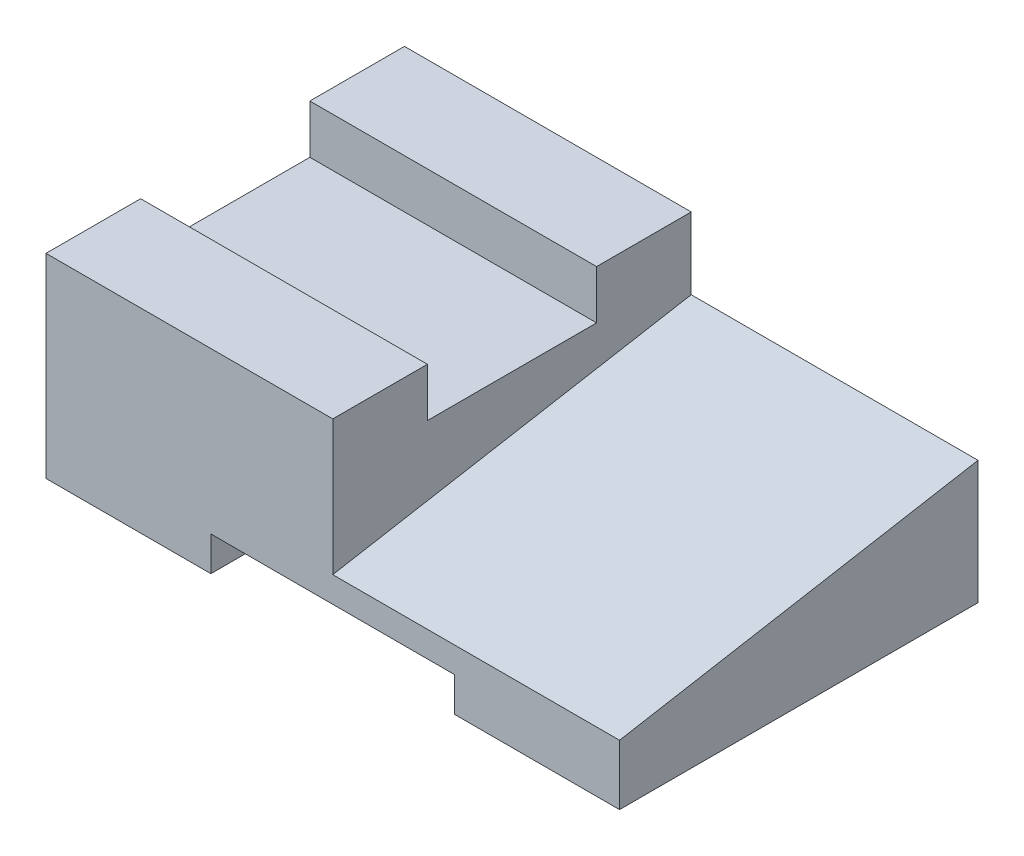
ISO-10303-21;
HEADER;
FILE_DESCRIPTION(('STEP AP214'),'2;1');
FILE_NAME('part.step','',(''),(''),'','','');
FILE_SCHEMA(('AUTOMOTIVE_DESIGN { 1 0 10303 214 1 1 1 1 }'));
ENDSEC;
DATA;
#1=APPLICATION_CONTEXT('core data for automotive mechanical design processes');
#2=APPLICATION_PROTOCOL_DEFINITION('international standard','automotive_design',2000,#1);
#3=PRODUCT_CONTEXT('',#1,'mechanical');
#4=PRODUCT('Part','Part','',(#3));
#5=PRODUCT_RELATED_PRODUCT_CATEGORY('part','',(#4));
#6=PRODUCT_DEFINITION_FORMATION('','',#4);
#7=PRODUCT_DEFINITION_CONTEXT('part definition',#1,'design');
#8=PRODUCT_DEFINITION('design','',#6,#7);
#9=PRODUCT_DEFINITION_SHAPE('','',#8);
#10=(LENGTH_UNIT() NAMED_UNIT(*) SI_UNIT(.MILLI.,.METRE.));
#11=(NAMED_UNIT(*) PLANE_ANGLE_UNIT() SI_UNIT($,.RADIAN.));
#12=(NAMED_UNIT(*) SI_UNIT($,.STERADIAN.) SOLID_ANGLE_UNIT());
#13=UNCERTAINTY_MEASURE_WITH_UNIT(LENGTH_MEASURE(1.E-05),#10,'distance_accuracy_value','');
#14=(GEOMETRIC_REPRESENTATION_CONTEXT(3) GLOBAL_UNCERTAINTY_ASSIGNED_CONTEXT((#13)) GLOBAL_UNIT_ASSIGNED_CONTEXT((#10,
#11,#12)) REPRESENTATION_CONTEXT('',''));
#15=CARTESIAN_POINT('',(0.,0.,0.));
#16=DIRECTION('',(0.,0.,1.));
#17=DIRECTION('',(1.,0.,0.));
#18=AXIS2_PLACEMENT_3D('',#15,#16,#17);
#19=CARTESIAN_POINT('',(0.,68.,-125.));
#20=DIRECTION('',(0.,-1.,0.));
#21=DIRECTION('',(0.,0.,-1.));
#22=AXIS2_PLACEMENT_3D('',#19,#20,#21);
#23=PLANE('',#22);
#24=DIRECTION('',(1.,0.,0.));
#25=VECTOR('',#24,1.);
#26=CARTESIAN_POINT('',(-100.,68.,-33.));
#27=LINE('',#26,#25);
#28=CARTESIAN_POINT('',(-100.,68.,-33.));
#29=VERTEX_POINT('',#28);
#30=CARTESIAN_POINT('',(0.,68.,-33.));
#31=VERTEX_POINT('',#30);
#32=EDGE_CURVE('E170',#29,#31,#27,.T.);
#33=ORIENTED_EDGE('',*,*,#32,.F.);
#34=DIRECTION('',(0.,0.,1.));
#35=VECTOR('',#34,1.);
#36=CARTESIAN_POINT('',(-100.,68.,-125.));
#37=LINE('',#36,#35);
#38=CARTESIAN_POINT('',(-100.,68.,0.));
#39=VERTEX_POINT('',#38);
#40=EDGE_CURVE('E238',#29,#39,#37,.T.);
#41=ORIENTED_EDGE('',*,*,#40,.T.);
#42=DIRECTION('',(1.,0.,0.));
#43=VECTOR('',#42,1.);
#44=CARTESIAN_POINT('',(0.,68.,0.));
#45=LINE('',#44,#43);
#46=CARTESIAN_POINT('',(0.,68.,0.));
#47=VERTEX_POINT('',#46);
#48=EDGE_CURVE('E217',#39,#47,#45,.T.);
#49=ORIENTED_EDGE('',*,*,#48,.T.);
#50=DIRECTION('',(0.,0.,1.));
#51=VECTOR('',#50,1.);
#52=CARTESIAN_POINT('',(0.,68.,0.));
#53=LINE('',#52,#51);
#54=EDGE_CURVE('E175',#31,#47,#53,.T.);
#55=ORIENTED_EDGE('',*,*,#54,.F.);
#56=EDGE_LOOP('',(#33,#41,#49,#55));
#57=FACE_BOUND('',#56,.T.);
#58=ADVANCED_FACE('F41',(#57),#23,.F.);
#59=CARTESIAN_POINT('',(-100.,68.,-125.));
#60=VERTEX_POINT('',#59);
#61=CARTESIAN_POINT('',(-100.,68.,-92.));
#62=VERTEX_POINT('',#61);
#63=EDGE_CURVE('E236',#60,#62,#37,.T.);
#64=ORIENTED_EDGE('',*,*,#63,.T.);
#65=DIRECTION('',(1.,0.,0.));
#66=VECTOR('',#65,1.);
#67=CARTESIAN_POINT('',(-100.,68.,-92.));
#68=LINE('',#67,#66);
#69=CARTESIAN_POINT('',(0.,68.,-92.));
#70=VERTEX_POINT('',#69);
#71=EDGE_CURVE('E146',#62,#70,#68,.T.);
#72=ORIENTED_EDGE('',*,*,#71,.T.);
#73=CARTESIAN_POINT('',(0.,68.,-125.));
#74=VERTEX_POINT('',#73);
#75=EDGE_CURVE('E174',#74,#70,#53,.T.);
#76=ORIENTED_EDGE('',*,*,#75,.F.);
#77=DIRECTION('',(1.,0.,0.));
#78=VECTOR('',#77,1.);
#79=CARTESIAN_POINT('',(0.,68.,-125.));
#80=LINE('',#79,#78);
#81=EDGE_CURVE('E197',#60,#74,#80,.T.);
#82=ORIENTED_EDGE('',*,*,#81,.F.);
#83=EDGE_LOOP('',(#64,#72,#76,#82));
#84=FACE_BOUND('',#83,.T.);
#85=ADVANCED_FACE('F247',(#84),#23,.F.);
#86=CARTESIAN_POINT('',(100.,0.,-125.));
#87=DIRECTION('',(1.,0.,0.));
#88=DIRECTION('',(0.,0.,-1.));
#89=AXIS2_PLACEMENT_3D('',#86,#87,#88);
#90=PLANE('',#89);
#91=DIRECTION('',(0.,1.,0.));
#92=VECTOR('',#91,1.);
#93=CARTESIAN_POINT('',(100.,0.,-125.));
#94=LINE('',#93,#92);
#95=CARTESIAN_POINT('',(100.,0.,-125.));
#96=VERTEX_POINT('',#95);
#97=CARTESIAN_POINT('',(100.,43.,-125.));
#98=VERTEX_POINT('',#97);
#99=EDGE_CURVE('E194',#96,#98,#94,.T.);
#100=ORIENTED_EDGE('',*,*,#99,.T.);
#101=DIRECTION('',(0.,-0.173648177666924,0.984807753012209));
#102=VECTOR('',#101,1.);
#103=CARTESIAN_POINT('',(100.,20.3271323890436,3.58422188062117));
#104=LINE('',#103,#102);
#105=CARTESIAN_POINT('',(100.,20.9591274114427,0.));
#106=VERTEX_POINT('',#105);
#107=EDGE_CURVE('E167',#98,#106,#104,.T.);
#108=ORIENTED_EDGE('',*,*,#107,.T.);
#109=DIRECTION('',(0.,1.,0.));
#110=VECTOR('',#109,1.);
#111=CARTESIAN_POINT('',(100.,0.,0.));
#112=LINE('',#111,#110);
#113=CARTESIAN_POINT('',(100.,0.,0.));
#114=VERTEX_POINT('',#113);
#115=EDGE_CURVE('E212',#114,#106,#112,.T.);
#116=ORIENTED_EDGE('',*,*,#115,.F.);
#117=DIRECTION('',(0.,0.,1.));
#118=VECTOR('',#117,1.);
#119=CARTESIAN_POINT('',(100.,0.,-125.));
#120=LINE('',#119,#118);
#121=EDGE_CURVE('E242',#96,#114,#120,.T.);
#122=ORIENTED_EDGE('',*,*,#121,.F.);
#123=EDGE_LOOP('',(#100,#108,#116,#122));
#124=FACE_BOUND('',#123,.T.);
#125=ADVANCED_FACE('F284',(#124),#90,.T.);
#126=CARTESIAN_POINT('',(42.5,0.,-125.));
#127=DIRECTION('',(1.,0.,0.));
#128=DIRECTION('',(0.,0.,-1.));
#129=AXIS2_PLACEMENT_3D('',#126,#127,#128);
#130=PLANE('',#129);
#131=DIRECTION('',(0.,1.,0.));
#132=VECTOR('',#131,1.);
#133=CARTESIAN_POINT('',(42.5,0.,0.));
#134=LINE('',#133,#132);
#135=CARTESIAN_POINT('',(42.5,0.,0.));
#136=VERTEX_POINT('',#135);
#137=CARTESIAN_POINT('',(42.5,12.,0.));
#138=VERTEX_POINT('',#137);
#139=EDGE_CURVE('E183',#136,#138,#134,.T.);
#140=ORIENTED_EDGE('',*,*,#139,.T.);
#141=DIRECTION('',(0.,0.,1.));
#142=VECTOR('',#141,1.);
#143=CARTESIAN_POINT('',(42.5,12.,-125.));
#144=LINE('',#143,#142);
#145=CARTESIAN_POINT('',(42.5,12.,-125.));
#146=VERTEX_POINT('',#145);
#147=EDGE_CURVE('E226',#146,#138,#144,.T.);
#148=ORIENTED_EDGE('',*,*,#147,.F.);
#149=DIRECTION('',(0.,1.,0.));
#150=VECTOR('',#149,1.);
#151=CARTESIAN_POINT('',(42.5,0.,-125.));
#152=LINE('',#151,#150);
#153=CARTESIAN_POINT('',(42.5,0.,-125.));
#154=VERTEX_POINT('',#153);
#155=EDGE_CURVE('E190',#154,#146,#152,.T.);
#156=ORIENTED_EDGE('',*,*,#155,.F.);
#157=DIRECTION('',(0.,0.,1.));
#158=VECTOR('',#157,1.);
#159=CARTESIAN_POINT('',(42.5,0.,-125.));
#160=LINE('',#159,#158);
#161=EDGE_CURVE('E208',#154,#136,#160,.T.);
#162=ORIENTED_EDGE('',*,*,#161,.T.);
#163=EDGE_LOOP('',(#140,#148,#156,#162));
#164=FACE_BOUND('',#163,.T.);
#165=ADVANCED_FACE('F43',(#164),#130,.F.);
#166=CARTESIAN_POINT('',(0.,12.,-125.));
#167=DIRECTION('',(0.,-1.,0.));
#168=DIRECTION('',(0.,0.,-1.));
#169=AXIS2_PLACEMENT_3D('',#166,#167,#168);
#170=PLANE('',#169);
#171=DIRECTION('',(1.,0.,0.));
#172=VECTOR('',#171,1.);
#173=CARTESIAN_POINT('',(0.,12.,0.));
#174=LINE('',#173,#172);
#175=CARTESIAN_POINT('',(-42.5,12.,0.));
#176=VERTEX_POINT('',#175);
#177=EDGE_CURVE('E188',#176,#138,#174,.T.);
#178=ORIENTED_EDGE('',*,*,#177,.F.);
#179=DIRECTION('',(0.,0.,1.));
#180=VECTOR('',#179,1.);
#181=CARTESIAN_POINT('',(-42.5,12.,-125.));
#182=LINE('',#181,#180);
#183=CARTESIAN_POINT('',(-42.5,12.,-125.));
#184=VERTEX_POINT('',#183);
#185=EDGE_CURVE('E235',#184,#176,#182,.T.);
#186=ORIENTED_EDGE('',*,*,#185,.F.);
#187=DIRECTION('',(1.,0.,0.));
#188=VECTOR('',#187,1.);
#189=CARTESIAN_POINT('',(0.,12.,-125.));
#190=LINE('',#189,#188);
#191=EDGE_CURVE('E202',#184,#146,#190,.T.);
#192=ORIENTED_EDGE('',*,*,#191,.T.);
#193=ORIENTED_EDGE('',*,*,#147,.T.);
#194=EDGE_LOOP('',(#178,#186,#192,#193));
#195=FACE_BOUND('',#194,.T.);
#196=ADVANCED_FACE('F275',(#195),#170,.T.);
#197=CARTESIAN_POINT('',(-42.5,0.,-125.));
#198=DIRECTION('',(1.,0.,0.));
#199=DIRECTION('',(0.,0.,-1.));
#200=AXIS2_PLACEMENT_3D('',#197,#198,#199);
#201=PLANE('',#200);
#202=DIRECTION('',(0.,1.,0.));
#203=VECTOR('',#202,1.);
#204=CARTESIAN_POINT('',(-42.5,0.,0.));
#205=LINE('',#204,#203);
#206=CARTESIAN_POINT('',(-42.5,0.,0.));
#207=VERTEX_POINT('',#206);
#208=EDGE_CURVE('E221',#207,#176,#205,.T.);
#209=ORIENTED_EDGE('',*,*,#208,.F.);
#210=DIRECTION('',(0.,0.,1.));
#211=VECTOR('',#210,1.);
#212=CARTESIAN_POINT('',(-42.5,0.,-125.));
#213=LINE('',#212,#211);
#214=CARTESIAN_POINT('',(-42.5,0.,-125.));
#215=VERTEX_POINT('',#214);
#216=EDGE_CURVE('E231',#215,#207,#213,.T.);
#217=ORIENTED_EDGE('',*,*,#216,.F.);
#218=DIRECTION('',(0.,1.,0.));
#219=VECTOR('',#218,1.);
#220=CARTESIAN_POINT('',(-42.5,0.,-125.));
#221=LINE('',#220,#219);
#222=EDGE_CURVE('E205',#215,#184,#221,.T.);
#223=ORIENTED_EDGE('',*,*,#222,.T.);
#224=ORIENTED_EDGE('',*,*,#185,.T.);
#225=EDGE_LOOP('',(#209,#217,#223,#224));
#226=FACE_BOUND('',#225,.T.);
#227=ADVANCED_FACE('F268',(#226),#201,.T.);
#228=CARTESIAN_POINT('',(0.,0.,-125.));
#229=DIRECTION('',(0.,-1.,0.));
#230=DIRECTION('',(0.,0.,-1.));
#231=AXIS2_PLACEMENT_3D('',#228,#229,#230);
#232=PLANE('',#231);
#233=DIRECTION('',(1.,0.,0.));
#234=VECTOR('',#233,1.);
#235=CARTESIAN_POINT('',(0.,0.,0.));
#236=LINE('',#235,#234);
#237=CARTESIAN_POINT('',(-100.,0.,0.));
#238=VERTEX_POINT('',#237);
#239=EDGE_CURVE('E214',#238,#207,#236,.T.);
#240=ORIENTED_EDGE('',*,*,#239,.F.);
#241=DIRECTION('',(0.,0.,1.));
#242=VECTOR('',#241,1.);
#243=CARTESIAN_POINT('',(-100.,0.,-125.));
#244=LINE('',#243,#242);
#245=CARTESIAN_POINT('',(-100.,0.,-125.));
#246=VERTEX_POINT('',#245);
#247=EDGE_CURVE('E237',#246,#238,#244,.T.);
#248=ORIENTED_EDGE('',*,*,#247,.F.);
#249=DIRECTION('',(1.,0.,0.));
#250=VECTOR('',#249,1.);
#251=CARTESIAN_POINT('',(0.,0.,-125.));
#252=LINE('',#251,#250);
#253=EDGE_CURVE('E191',#246,#215,#252,.T.);
#254=ORIENTED_EDGE('',*,*,#253,.T.);
#255=ORIENTED_EDGE('',*,*,#216,.T.);
#256=EDGE_LOOP('',(#240,#248,#254,#255));
#257=FACE_BOUND('',#256,.T.);
#258=ADVANCED_FACE('F264',(#257),#232,.T.);
#259=CARTESIAN_POINT('',(-100.,0.,-125.));
#260=DIRECTION('',(1.,0.,0.));
#261=DIRECTION('',(0.,0.,-1.));
#262=AXIS2_PLACEMENT_3D('',#259,#260,#261);
#263=PLANE('',#262);
#264=ORIENTED_EDGE('',*,*,#40,.F.);
#265=DIRECTION('',(0.,-1.,0.));
#266=VECTOR('',#265,1.);
#267=CARTESIAN_POINT('',(-100.,0.,-33.));
#268=LINE('',#267,#266);
#269=CARTESIAN_POINT('',(-100.,51.,-33.));
#270=VERTEX_POINT('',#269);
#271=EDGE_CURVE('E149',#29,#270,#268,.T.);
#272=ORIENTED_EDGE('',*,*,#271,.T.);
#273=DIRECTION('',(0.,0.,-1.));
#274=VECTOR('',#273,1.);
#275=CARTESIAN_POINT('',(-100.,51.,0.));
#276=LINE('',#275,#274);
#277=CARTESIAN_POINT('',(-100.,51.,-92.));
#278=VERTEX_POINT('',#277);
#279=EDGE_CURVE('E145',#270,#278,#276,.T.);
#280=ORIENTED_EDGE('',*,*,#279,.T.);
#281=DIRECTION('',(0.,1.,0.));
#282=VECTOR('',#281,1.);
#283=CARTESIAN_POINT('',(-100.,0.,-92.));
#284=LINE('',#283,#282);
#285=EDGE_CURVE('E155',#278,#62,#284,.T.);
#286=ORIENTED_EDGE('',*,*,#285,.T.);
#287=ORIENTED_EDGE('',*,*,#63,.F.);
#288=DIRECTION('',(0.,1.,0.));
#289=VECTOR('',#288,1.);
#290=CARTESIAN_POINT('',(-100.,0.,-125.));
#291=LINE('',#290,#289);
#292=EDGE_CURVE('E199',#246,#60,#291,.T.);
#293=ORIENTED_EDGE('',*,*,#292,.F.);
#294=ORIENTED_EDGE('',*,*,#247,.T.);
#295=DIRECTION('',(0.,1.,0.));
#296=VECTOR('',#295,1.);
#297=CARTESIAN_POINT('',(-100.,0.,0.));
#298=LINE('',#297,#296);
#299=EDGE_CURVE('E222',#238,#39,#298,.T.);
#300=ORIENTED_EDGE('',*,*,#299,.T.);
#301=EDGE_LOOP('',(#264,#272,#280,#286,#287,#293,#294,#300));
#302=FACE_BOUND('',#301,.T.);
#303=ADVANCED_FACE('F159',(#302),#263,.F.);
#304=EDGE_CURVE('E211',#136,#114,#236,.T.);
#305=ORIENTED_EDGE('',*,*,#304,.F.);
#306=ORIENTED_EDGE('',*,*,#161,.F.);
#307=EDGE_CURVE('E186',#154,#96,#252,.T.);
#308=ORIENTED_EDGE('',*,*,#307,.T.);
#309=ORIENTED_EDGE('',*,*,#121,.T.);
#310=EDGE_LOOP('',(#305,#306,#308,#309));
#311=FACE_BOUND('',#310,.T.);
#312=ADVANCED_FACE('F276',(#311),#232,.T.);
#313=CARTESIAN_POINT('',(0.,0.,-125.));
#314=DIRECTION('',(0.,0.,1.));
#315=DIRECTION('',(1.,0.,0.));
#316=AXIS2_PLACEMENT_3D('',#313,#314,#315);
#317=PLANE('',#316);
#318=DIRECTION('',(0.,1.,0.));
#319=VECTOR('',#318,1.);
#320=CARTESIAN_POINT('',(0.,0.,-125.));
#321=LINE('',#320,#319);
#322=CARTESIAN_POINT('',(0.,43.,-125.));
#323=VERTEX_POINT('',#322);
#324=EDGE_CURVE('E168',#323,#74,#321,.T.);
#325=ORIENTED_EDGE('',*,*,#324,.F.);
#326=DIRECTION('',(1.,0.,0.));
#327=VECTOR('',#326,1.);
#328=CARTESIAN_POINT('',(0.,43.,-125.));
#329=LINE('',#328,#327);
#330=EDGE_CURVE('E185',#323,#98,#329,.T.);
#331=ORIENTED_EDGE('',*,*,#330,.T.);
#332=ORIENTED_EDGE('',*,*,#99,.F.);
#333=ORIENTED_EDGE('',*,*,#307,.F.);
#334=ORIENTED_EDGE('',*,*,#155,.T.);
#335=ORIENTED_EDGE('',*,*,#191,.F.);
#336=ORIENTED_EDGE('',*,*,#222,.F.);
#337=ORIENTED_EDGE('',*,*,#253,.F.);
#338=ORIENTED_EDGE('',*,*,#292,.T.);
#339=ORIENTED_EDGE('',*,*,#81,.T.);
#340=EDGE_LOOP('',(#325,#331,#332,#333,#334,#335,#336,#337,#338,#339));
#341=FACE_BOUND('',#340,.T.);
#342=ADVANCED_FACE('F252',(#341),#317,.F.);
#343=CARTESIAN_POINT('',(0.,0.,0.));
#344=DIRECTION('',(0.,0.,1.));
#345=DIRECTION('',(1.,0.,0.));
#346=AXIS2_PLACEMENT_3D('',#343,#344,#345);
#347=PLANE('',#346);
#348=DIRECTION('',(0.,-1.,0.));
#349=VECTOR('',#348,1.);
#350=CARTESIAN_POINT('',(0.,0.,0.));
#351=LINE('',#350,#349);
#352=CARTESIAN_POINT('',(0.,20.9591274114427,0.));
#353=VERTEX_POINT('',#352);
#354=EDGE_CURVE('E61',#47,#353,#351,.T.);
#355=ORIENTED_EDGE('',*,*,#354,.F.);
#356=ORIENTED_EDGE('',*,*,#48,.F.);
#357=ORIENTED_EDGE('',*,*,#299,.F.);
#358=ORIENTED_EDGE('',*,*,#239,.T.);
#359=ORIENTED_EDGE('',*,*,#208,.T.);
#360=ORIENTED_EDGE('',*,*,#177,.T.);
#361=ORIENTED_EDGE('',*,*,#139,.F.);
#362=ORIENTED_EDGE('',*,*,#304,.T.);
#363=ORIENTED_EDGE('',*,*,#115,.T.);
#364=DIRECTION('',(1.,0.,0.));
#365=VECTOR('',#364,1.);
#366=CARTESIAN_POINT('',(0.,20.9591274114427,0.));
#367=LINE('',#366,#365);
#368=EDGE_CURVE('E176',#353,#106,#367,.T.);
#369=ORIENTED_EDGE('',*,*,#368,.F.);
#370=EDGE_LOOP('',(#355,#356,#357,#358,#359,#360,#361,#362,#363,#369));
#371=FACE_BOUND('',#370,.T.);
#372=ADVANCED_FACE('F262',(#371),#347,.T.);
#373=CARTESIAN_POINT('',(0.,20.3271323890436,3.58422188062117));
#374=DIRECTION('',(0.,0.984807753012209,0.173648177666924));
#375=DIRECTION('',(0.,-0.173648177666924,0.984807753012209));
#376=AXIS2_PLACEMENT_3D('',#373,#374,#375);
#377=PLANE('',#376);
#378=ORIENTED_EDGE('',*,*,#107,.F.);
#379=ORIENTED_EDGE('',*,*,#330,.F.);
#380=DIRECTION('',(0.,-0.173648177666924,0.984807753012209));
#381=VECTOR('',#380,1.);
#382=CARTESIAN_POINT('',(0.,20.3271323890436,3.58422188062117));
#383=LINE('',#382,#381);
#384=EDGE_CURVE('E180',#323,#353,#383,.T.);
#385=ORIENTED_EDGE('',*,*,#384,.T.);
#386=ORIENTED_EDGE('',*,*,#368,.T.);
#387=EDGE_LOOP('',(#378,#379,#385,#386));
#388=FACE_BOUND('',#387,.T.);
#389=ADVANCED_FACE('F287',(#388),#377,.T.);
#390=CARTESIAN_POINT('',(0.,0.,0.));
#391=DIRECTION('',(1.,0.,0.));
#392=DIRECTION('',(0.,0.,-1.));
#393=AXIS2_PLACEMENT_3D('',#390,#391,#392);
#394=PLANE('',#393);
#395=DIRECTION('',(0.,-1.,0.));
#396=VECTOR('',#395,1.);
#397=CARTESIAN_POINT('',(0.,0.,-33.));
#398=LINE('',#397,#396);
#399=CARTESIAN_POINT('',(0.,51.,-33.));
#400=VERTEX_POINT('',#399);
#401=EDGE_CURVE('E11',#31,#400,#398,.T.);
#402=ORIENTED_EDGE('',*,*,#401,.F.);
#403=ORIENTED_EDGE('',*,*,#54,.T.);
#404=ORIENTED_EDGE('',*,*,#354,.T.);
#405=ORIENTED_EDGE('',*,*,#384,.F.);
#406=ORIENTED_EDGE('',*,*,#324,.T.);
#407=ORIENTED_EDGE('',*,*,#75,.T.);
#408=DIRECTION('',(0.,1.,0.));
#409=VECTOR('',#408,1.);
#410=CARTESIAN_POINT('',(0.,0.,-92.));
#411=LINE('',#410,#409);
#412=CARTESIAN_POINT('',(0.,51.,-92.));
#413=VERTEX_POINT('',#412);
#414=EDGE_CURVE('E232',#413,#70,#411,.T.);
#415=ORIENTED_EDGE('',*,*,#414,.F.);
#416=DIRECTION('',(0.,0.,-1.));
#417=VECTOR('',#416,1.);
#418=CARTESIAN_POINT('',(0.,51.,0.));
#419=LINE('',#418,#417);
#420=EDGE_CURVE('E47',#400,#413,#419,.T.);
#421=ORIENTED_EDGE('',*,*,#420,.F.);
#422=EDGE_LOOP('',(#402,#403,#404,#405,#406,#407,#415,#421));
#423=FACE_BOUND('',#422,.T.);
#424=ADVANCED_FACE('F246',(#423),#394,.T.);
#425=CARTESIAN_POINT('',(-100.,51.,0.));
#426=DIRECTION('',(0.,-1.,0.));
#427=DIRECTION('',(0.,0.,-1.));
#428=AXIS2_PLACEMENT_3D('',#425,#426,#427);
#429=PLANE('',#428);
#430=ORIENTED_EDGE('',*,*,#420,.T.);
#431=DIRECTION('',(1.,0.,0.));
#432=VECTOR('',#431,1.);
#433=CARTESIAN_POINT('',(-100.,51.,-92.));
#434=LINE('',#433,#432);
#435=EDGE_CURVE('E57',#278,#413,#434,.T.);
#436=ORIENTED_EDGE('',*,*,#435,.F.);
#437=ORIENTED_EDGE('',*,*,#279,.F.);
#438=DIRECTION('',(1.,0.,0.));
#439=VECTOR('',#438,1.);
#440=CARTESIAN_POINT('',(-100.,51.,-33.));
#441=LINE('',#440,#439);
#442=EDGE_CURVE('E163',#270,#400,#441,.T.);
#443=ORIENTED_EDGE('',*,*,#442,.T.);
#444=EDGE_LOOP('',(#430,#436,#437,#443));
#445=FACE_BOUND('',#444,.T.);
#446=ADVANCED_FACE('F143',(#445),#429,.F.);
#447=CARTESIAN_POINT('',(-100.,0.,-33.));
#448=DIRECTION('',(0.,0.,1.));
#449=DIRECTION('',(1.,0.,0.));
#450=AXIS2_PLACEMENT_3D('',#447,#448,#449);
#451=PLANE('',#450);
#452=ORIENTED_EDGE('',*,*,#401,.T.);
#453=ORIENTED_EDGE('',*,*,#442,.F.);
#454=ORIENTED_EDGE('',*,*,#271,.F.);
#455=ORIENTED_EDGE('',*,*,#32,.T.);
#456=EDGE_LOOP('',(#452,#453,#454,#455));
#457=FACE_BOUND('',#456,.T.);
#458=ADVANCED_FACE('F371',(#457),#451,.F.);
#459=CARTESIAN_POINT('',(-100.,0.,-92.));
#460=DIRECTION('',(0.,0.,-1.));
#461=DIRECTION('',(-1.,0.,0.));
#462=AXIS2_PLACEMENT_3D('',#459,#460,#461);
#463=PLANE('',#462);
#464=ORIENTED_EDGE('',*,*,#414,.T.);
#465=ORIENTED_EDGE('',*,*,#71,.F.);
#466=ORIENTED_EDGE('',*,*,#285,.F.);
#467=ORIENTED_EDGE('',*,*,#435,.T.);
#468=EDGE_LOOP('',(#464,#465,#466,#467));
#469=FACE_BOUND('',#468,.T.);
#470=ADVANCED_FACE('F153',(#469),#463,.F.);
#471=CLOSED_SHELL('',(#58,#85,#125,#165,#196,#227,#258,#303,#312,#342,#372,#389,#424,#446,#458,#470));
#472=MANIFOLD_SOLID_BREP('B2',#471);
#473=ADVANCED_BREP_SHAPE_REPRESENTATION('',(#18,#472),#14);
#474=SHAPE_DEFINITION_REPRESENTATION(#9,#473);
ENDSEC;
END-ISO-10303-21;
